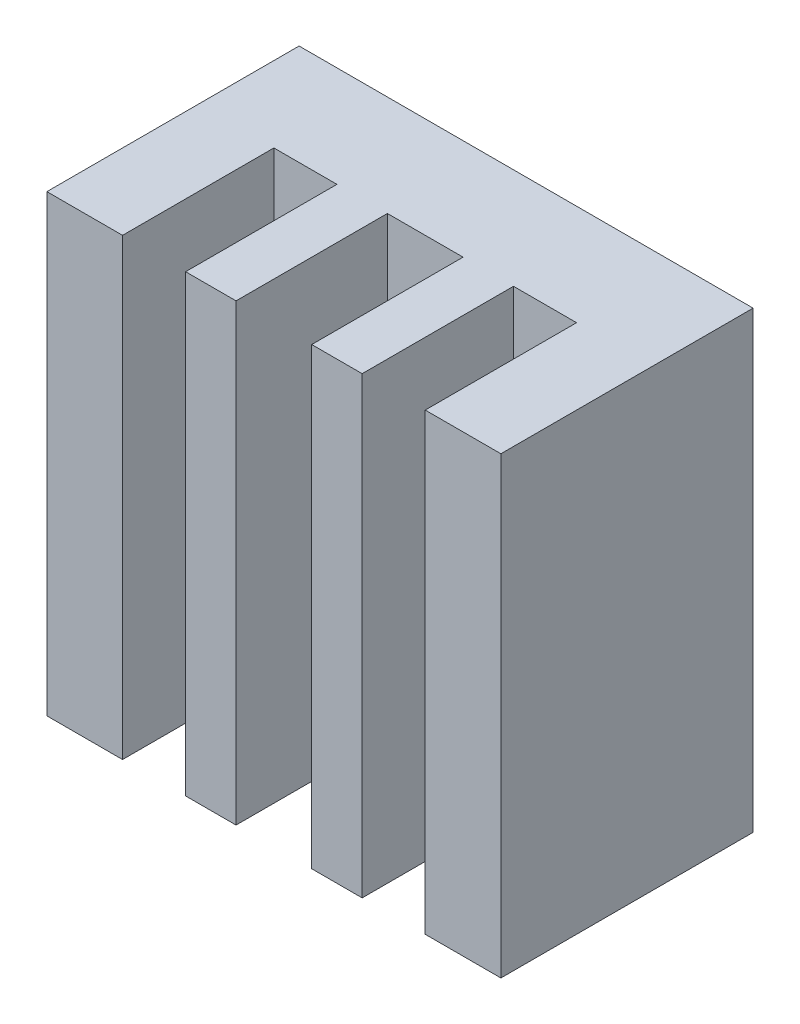
ISO-10303-21;
HEADER;
FILE_DESCRIPTION(('STEP AP214'),'2;1');
FILE_NAME('part.step','',(''),(''),'','','');
FILE_SCHEMA(('AUTOMOTIVE_DESIGN { 1 0 10303 214 1 1 1 1 }'));
ENDSEC;
DATA;
#1=APPLICATION_CONTEXT('core data for automotive mechanical design processes');
#2=APPLICATION_PROTOCOL_DEFINITION('international standard','automotive_design',2000,#1);
#3=PRODUCT_CONTEXT('',#1,'mechanical');
#4=PRODUCT('Part','Part','',(#3));
#5=PRODUCT_RELATED_PRODUCT_CATEGORY('part','',(#4));
#6=PRODUCT_DEFINITION_FORMATION('','',#4);
#7=PRODUCT_DEFINITION_CONTEXT('part definition',#1,'design');
#8=PRODUCT_DEFINITION('design','',#6,#7);
#9=PRODUCT_DEFINITION_SHAPE('','',#8);
#10=(LENGTH_UNIT() NAMED_UNIT(*) SI_UNIT(.MILLI.,.METRE.));
#11=(NAMED_UNIT(*) PLANE_ANGLE_UNIT() SI_UNIT($,.RADIAN.));
#12=(NAMED_UNIT(*) SI_UNIT($,.STERADIAN.) SOLID_ANGLE_UNIT());
#13=UNCERTAINTY_MEASURE_WITH_UNIT(LENGTH_MEASURE(1.E-05),#10,'distance_accuracy_value','');
#14=(GEOMETRIC_REPRESENTATION_CONTEXT(3) GLOBAL_UNCERTAINTY_ASSIGNED_CONTEXT((#13)) GLOBAL_UNIT_ASSIGNED_CONTEXT((#10,
#11,#12)) REPRESENTATION_CONTEXT('',''));
#15=CARTESIAN_POINT('',(0.,0.,0.));
#16=DIRECTION('',(0.,0.,1.));
#17=DIRECTION('',(1.,0.,0.));
#18=AXIS2_PLACEMENT_3D('',#15,#16,#17);
#19=CARTESIAN_POINT('',(0.,0.,5.));
#20=DIRECTION('',(0.,1.,0.));
#21=DIRECTION('',(0.,0.,1.));
#22=AXIS2_PLACEMENT_3D('',#19,#20,#21);
#23=PLANE('',#22);
#24=DIRECTION('',(0.,0.,-1.));
#25=VECTOR('',#24,1.);
#26=CARTESIAN_POINT('',(2.75,0.,0.));
#27=LINE('',#26,#25);
#28=CARTESIAN_POINT('',(2.75,0.,5.));
#29=VERTEX_POINT('',#28);
#30=CARTESIAN_POINT('',(2.75,0.,2.));
#31=VERTEX_POINT('',#30);
#32=EDGE_CURVE('E160',#29,#31,#27,.T.);
#33=ORIENTED_EDGE('',*,*,#32,.T.);
#34=DIRECTION('',(1.,0.,0.));
#35=VECTOR('',#34,1.);
#36=CARTESIAN_POINT('',(0.,0.,2.));
#37=LINE('',#36,#35);
#38=CARTESIAN_POINT('',(1.5,0.,2.));
#39=VERTEX_POINT('',#38);
#40=EDGE_CURVE('E316',#39,#31,#37,.T.);
#41=ORIENTED_EDGE('',*,*,#40,.F.);
#42=DIRECTION('',(0.,0.,-1.));
#43=VECTOR('',#42,1.);
#44=CARTESIAN_POINT('',(1.5,0.,0.));
#45=LINE('',#44,#43);
#46=CARTESIAN_POINT('',(1.5,0.,5.));
#47=VERTEX_POINT('',#46);
#48=EDGE_CURVE('E172',#47,#39,#45,.T.);
#49=ORIENTED_EDGE('',*,*,#48,.F.);
#50=DIRECTION('',(1.,0.,0.));
#51=VECTOR('',#50,1.);
#52=CARTESIAN_POINT('',(0.,0.,5.));
#53=LINE('',#52,#51);
#54=CARTESIAN_POINT('',(0.,0.,5.));
#55=VERTEX_POINT('',#54);
#56=EDGE_CURVE('E192',#55,#47,#53,.T.);
#57=ORIENTED_EDGE('',*,*,#56,.F.);
#58=DIRECTION('',(0.,0.,-1.));
#59=VECTOR('',#58,1.);
#60=CARTESIAN_POINT('',(0.,0.,5.));
#61=LINE('',#60,#59);
#62=CARTESIAN_POINT('',(0.,0.,0.));
#63=VERTEX_POINT('',#62);
#64=EDGE_CURVE('E239',#55,#63,#61,.T.);
#65=ORIENTED_EDGE('',*,*,#64,.T.);
#66=DIRECTION('',(1.,0.,0.));
#67=VECTOR('',#66,1.);
#68=CARTESIAN_POINT('',(0.,0.,0.));
#69=LINE('',#68,#67);
#70=CARTESIAN_POINT('',(9.,0.,0.));
#71=VERTEX_POINT('',#70);
#72=EDGE_CURVE('E218',#63,#71,#69,.T.);
#73=ORIENTED_EDGE('',*,*,#72,.T.);
#74=DIRECTION('',(0.,0.,-1.));
#75=VECTOR('',#74,1.);
#76=CARTESIAN_POINT('',(9.,0.,5.));
#77=LINE('',#76,#75);
#78=CARTESIAN_POINT('',(9.,0.,5.));
#79=VERTEX_POINT('',#78);
#80=EDGE_CURVE('E235',#79,#71,#77,.T.);
#81=ORIENTED_EDGE('',*,*,#80,.F.);
#82=CARTESIAN_POINT('',(7.5,0.,5.));
#83=VERTEX_POINT('',#82);
#84=EDGE_CURVE('E199',#83,#79,#53,.T.);
#85=ORIENTED_EDGE('',*,*,#84,.F.);
#86=DIRECTION('',(0.,0.,-1.));
#87=VECTOR('',#86,1.);
#88=CARTESIAN_POINT('',(7.5,0.,0.));
#89=LINE('',#88,#87);
#90=CARTESIAN_POINT('',(7.5,0.,2.));
#91=VERTEX_POINT('',#90);
#92=EDGE_CURVE('E284',#83,#91,#89,.T.);
#93=ORIENTED_EDGE('',*,*,#92,.T.);
#94=DIRECTION('',(1.,0.,0.));
#95=VECTOR('',#94,1.);
#96=CARTESIAN_POINT('',(0.,0.,2.));
#97=LINE('',#96,#95);
#98=CARTESIAN_POINT('',(6.25,0.,2.));
#99=VERTEX_POINT('',#98);
#100=EDGE_CURVE('E292',#99,#91,#97,.T.);
#101=ORIENTED_EDGE('',*,*,#100,.F.);
#102=DIRECTION('',(0.,0.,-1.));
#103=VECTOR('',#102,1.);
#104=CARTESIAN_POINT('',(6.25,0.,0.));
#105=LINE('',#104,#103);
#106=CARTESIAN_POINT('',(6.25,0.,5.));
#107=VERTEX_POINT('',#106);
#108=EDGE_CURVE('E288',#107,#99,#105,.T.);
#109=ORIENTED_EDGE('',*,*,#108,.F.);
#110=CARTESIAN_POINT('',(5.25,0.,5.));
#111=VERTEX_POINT('',#110);
#112=EDGE_CURVE('E193',#111,#107,#53,.T.);
#113=ORIENTED_EDGE('',*,*,#112,.F.);
#114=DIRECTION('',(0.,0.,-1.));
#115=VECTOR('',#114,1.);
#116=CARTESIAN_POINT('',(5.25,0.,0.));
#117=LINE('',#116,#115);
#118=CARTESIAN_POINT('',(5.25,0.,2.));
#119=VERTEX_POINT('',#118);
#120=EDGE_CURVE('E370',#111,#119,#117,.T.);
#121=ORIENTED_EDGE('',*,*,#120,.T.);
#122=DIRECTION('',(1.,0.,0.));
#123=VECTOR('',#122,1.);
#124=CARTESIAN_POINT('',(0.,0.,2.));
#125=LINE('',#124,#123);
#126=CARTESIAN_POINT('',(3.75,0.,2.));
#127=VERTEX_POINT('',#126);
#128=EDGE_CURVE('E300',#127,#119,#125,.T.);
#129=ORIENTED_EDGE('',*,*,#128,.F.);
#130=DIRECTION('',(0.,0.,-1.));
#131=VECTOR('',#130,1.);
#132=CARTESIAN_POINT('',(3.75,0.,0.));
#133=LINE('',#132,#131);
#134=CARTESIAN_POINT('',(3.75,0.,5.));
#135=VERTEX_POINT('',#134);
#136=EDGE_CURVE('E190',#135,#127,#133,.T.);
#137=ORIENTED_EDGE('',*,*,#136,.F.);
#138=EDGE_CURVE('E180',#29,#135,#53,.T.);
#139=ORIENTED_EDGE('',*,*,#138,.F.);
#140=EDGE_LOOP('',(#33,#41,#49,#57,#65,#73,#81,#85,#93,#101,#109,#113,#121,#129,#137,#139));
#141=FACE_BOUND('',#140,.T.);
#142=ADVANCED_FACE('F45',(#141),#23,.F.);
#143=CARTESIAN_POINT('',(0.,9.,5.));
#144=DIRECTION('',(0.,-1.,0.));
#145=DIRECTION('',(0.,0.,-1.));
#146=AXIS2_PLACEMENT_3D('',#143,#144,#145);
#147=PLANE('',#146);
#148=DIRECTION('',(0.,0.,-1.));
#149=VECTOR('',#148,1.);
#150=CARTESIAN_POINT('',(2.75,9.,5.));
#151=LINE('',#150,#149);
#152=CARTESIAN_POINT('',(2.75,9.,5.));
#153=VERTEX_POINT('',#152);
#154=CARTESIAN_POINT('',(2.75,9.,2.));
#155=VERTEX_POINT('',#154);
#156=EDGE_CURVE('E219',#153,#155,#151,.T.);
#157=ORIENTED_EDGE('',*,*,#156,.F.);
#158=DIRECTION('',(-1.,0.,0.));
#159=VECTOR('',#158,1.);
#160=CARTESIAN_POINT('',(0.,9.,5.));
#161=LINE('',#160,#159);
#162=CARTESIAN_POINT('',(3.75,9.,5.));
#163=VERTEX_POINT('',#162);
#164=EDGE_CURVE('E182',#163,#153,#161,.T.);
#165=ORIENTED_EDGE('',*,*,#164,.F.);
#166=DIRECTION('',(0.,0.,-1.));
#167=VECTOR('',#166,1.);
#168=CARTESIAN_POINT('',(3.75,9.,5.));
#169=LINE('',#168,#167);
#170=CARTESIAN_POINT('',(3.75,9.,2.));
#171=VERTEX_POINT('',#170);
#172=EDGE_CURVE('E268',#163,#171,#169,.T.);
#173=ORIENTED_EDGE('',*,*,#172,.T.);
#174=DIRECTION('',(1.,0.,0.));
#175=VECTOR('',#174,1.);
#176=CARTESIAN_POINT('',(0.,9.,2.));
#177=LINE('',#176,#175);
#178=CARTESIAN_POINT('',(5.25,9.,2.));
#179=VERTEX_POINT('',#178);
#180=EDGE_CURVE('E54',#171,#179,#177,.T.);
#181=ORIENTED_EDGE('',*,*,#180,.T.);
#182=DIRECTION('',(0.,0.,-1.));
#183=VECTOR('',#182,1.);
#184=CARTESIAN_POINT('',(5.25,9.,5.));
#185=LINE('',#184,#183);
#186=CARTESIAN_POINT('',(5.25,9.,5.));
#187=VERTEX_POINT('',#186);
#188=EDGE_CURVE('E266',#187,#179,#185,.T.);
#189=ORIENTED_EDGE('',*,*,#188,.F.);
#190=CARTESIAN_POINT('',(6.25,9.,5.));
#191=VERTEX_POINT('',#190);
#192=EDGE_CURVE('E213',#191,#187,#161,.T.);
#193=ORIENTED_EDGE('',*,*,#192,.F.);
#194=DIRECTION('',(0.,0.,-1.));
#195=VECTOR('',#194,1.);
#196=CARTESIAN_POINT('',(6.25,9.,5.));
#197=LINE('',#196,#195);
#198=CARTESIAN_POINT('',(6.25,9.,2.));
#199=VERTEX_POINT('',#198);
#200=EDGE_CURVE('E69',#191,#199,#197,.T.);
#201=ORIENTED_EDGE('',*,*,#200,.T.);
#202=DIRECTION('',(1.,0.,0.));
#203=VECTOR('',#202,1.);
#204=CARTESIAN_POINT('',(0.,9.,2.));
#205=LINE('',#204,#203);
#206=CARTESIAN_POINT('',(7.5,9.,2.));
#207=VERTEX_POINT('',#206);
#208=EDGE_CURVE('E184',#199,#207,#205,.T.);
#209=ORIENTED_EDGE('',*,*,#208,.T.);
#210=DIRECTION('',(0.,0.,-1.));
#211=VECTOR('',#210,1.);
#212=CARTESIAN_POINT('',(7.5,9.,5.));
#213=LINE('',#212,#211);
#214=CARTESIAN_POINT('',(7.5,9.,5.));
#215=VERTEX_POINT('',#214);
#216=EDGE_CURVE('E305',#215,#207,#213,.T.);
#217=ORIENTED_EDGE('',*,*,#216,.F.);
#218=CARTESIAN_POINT('',(9.,9.,5.));
#219=VERTEX_POINT('',#218);
#220=EDGE_CURVE('E208',#219,#215,#161,.T.);
#221=ORIENTED_EDGE('',*,*,#220,.F.);
#222=DIRECTION('',(0.,0.,-1.));
#223=VECTOR('',#222,1.);
#224=CARTESIAN_POINT('',(9.,9.,5.));
#225=LINE('',#224,#223);
#226=CARTESIAN_POINT('',(9.,9.,0.));
#227=VERTEX_POINT('',#226);
#228=EDGE_CURVE('E231',#219,#227,#225,.T.);
#229=ORIENTED_EDGE('',*,*,#228,.T.);
#230=DIRECTION('',(-1.,0.,0.));
#231=VECTOR('',#230,1.);
#232=CARTESIAN_POINT('',(0.,9.,0.));
#233=LINE('',#232,#231);
#234=CARTESIAN_POINT('',(0.,9.,0.));
#235=VERTEX_POINT('',#234);
#236=EDGE_CURVE('E225',#227,#235,#233,.T.);
#237=ORIENTED_EDGE('',*,*,#236,.T.);
#238=DIRECTION('',(0.,0.,-1.));
#239=VECTOR('',#238,1.);
#240=CARTESIAN_POINT('',(0.,9.,5.));
#241=LINE('',#240,#239);
#242=CARTESIAN_POINT('',(0.,9.,5.));
#243=VERTEX_POINT('',#242);
#244=EDGE_CURVE('E212',#243,#235,#241,.T.);
#245=ORIENTED_EDGE('',*,*,#244,.F.);
#246=CARTESIAN_POINT('',(1.5,9.,5.));
#247=VERTEX_POINT('',#246);
#248=EDGE_CURVE('E207',#247,#243,#161,.T.);
#249=ORIENTED_EDGE('',*,*,#248,.F.);
#250=DIRECTION('',(0.,0.,-1.));
#251=VECTOR('',#250,1.);
#252=CARTESIAN_POINT('',(1.5,9.,5.));
#253=LINE('',#252,#251);
#254=CARTESIAN_POINT('',(1.5,9.,2.));
#255=VERTEX_POINT('',#254);
#256=EDGE_CURVE('E61',#247,#255,#253,.T.);
#257=ORIENTED_EDGE('',*,*,#256,.T.);
#258=DIRECTION('',(1.,0.,0.));
#259=VECTOR('',#258,1.);
#260=CARTESIAN_POINT('',(0.,9.,2.));
#261=LINE('',#260,#259);
#262=EDGE_CURVE('E11',#255,#155,#261,.T.);
#263=ORIENTED_EDGE('',*,*,#262,.T.);
#264=EDGE_LOOP('',(#157,#165,#173,#181,#189,#193,#201,#209,#217,#221,#229,#237,#245,#249,#257,#263));
#265=FACE_BOUND('',#264,.T.);
#266=ADVANCED_FACE('F264',(#265),#147,.F.);
#267=CARTESIAN_POINT('',(0.,0.,5.));
#268=DIRECTION('',(0.,0.,-1.));
#269=DIRECTION('',(-1.,0.,0.));
#270=AXIS2_PLACEMENT_3D('',#267,#268,#269);
#271=PLANE('',#270);
#272=DIRECTION('',(0.,1.,0.));
#273=VECTOR('',#272,1.);
#274=CARTESIAN_POINT('',(2.75,0.,5.));
#275=LINE('',#274,#273);
#276=EDGE_CURVE('E163',#29,#153,#275,.T.);
#277=ORIENTED_EDGE('',*,*,#276,.F.);
#278=ORIENTED_EDGE('',*,*,#138,.T.);
#279=DIRECTION('',(0.,1.,0.));
#280=VECTOR('',#279,1.);
#281=CARTESIAN_POINT('',(3.75,0.,5.));
#282=LINE('',#281,#280);
#283=EDGE_CURVE('E252',#135,#163,#282,.T.);
#284=ORIENTED_EDGE('',*,*,#283,.T.);
#285=ORIENTED_EDGE('',*,*,#164,.T.);
#286=EDGE_LOOP('',(#277,#278,#284,#285));
#287=FACE_BOUND('',#286,.T.);
#288=ADVANCED_FACE('F178',(#287),#271,.F.);
#289=DIRECTION('',(0.,1.,0.));
#290=VECTOR('',#289,1.);
#291=CARTESIAN_POINT('',(5.25,0.,5.));
#292=LINE('',#291,#290);
#293=EDGE_CURVE('E249',#111,#187,#292,.T.);
#294=ORIENTED_EDGE('',*,*,#293,.F.);
#295=ORIENTED_EDGE('',*,*,#112,.T.);
#296=DIRECTION('',(0.,1.,0.));
#297=VECTOR('',#296,1.);
#298=CARTESIAN_POINT('',(6.25,0.,5.));
#299=LINE('',#298,#297);
#300=EDGE_CURVE('E243',#107,#191,#299,.T.);
#301=ORIENTED_EDGE('',*,*,#300,.T.);
#302=ORIENTED_EDGE('',*,*,#192,.T.);
#303=EDGE_LOOP('',(#294,#295,#301,#302));
#304=FACE_BOUND('',#303,.T.);
#305=ADVANCED_FACE('F330',(#304),#271,.F.);
#306=DIRECTION('',(0.,1.,0.));
#307=VECTOR('',#306,1.);
#308=CARTESIAN_POINT('',(7.5,0.,5.));
#309=LINE('',#308,#307);
#310=EDGE_CURVE('E246',#83,#215,#309,.T.);
#311=ORIENTED_EDGE('',*,*,#310,.F.);
#312=ORIENTED_EDGE('',*,*,#84,.T.);
#313=DIRECTION('',(0.,1.,0.));
#314=VECTOR('',#313,1.);
#315=CARTESIAN_POINT('',(9.,0.,5.));
#316=LINE('',#315,#314);
#317=EDGE_CURVE('E198',#79,#219,#316,.T.);
#318=ORIENTED_EDGE('',*,*,#317,.T.);
#319=ORIENTED_EDGE('',*,*,#220,.T.);
#320=EDGE_LOOP('',(#311,#312,#318,#319));
#321=FACE_BOUND('',#320,.T.);
#322=ADVANCED_FACE('F346',(#321),#271,.F.);
#323=CARTESIAN_POINT('',(0.,0.,5.));
#324=DIRECTION('',(1.,0.,0.));
#325=DIRECTION('',(0.,0.,-1.));
#326=AXIS2_PLACEMENT_3D('',#323,#324,#325);
#327=PLANE('',#326);
#328=DIRECTION('',(0.,-1.,0.));
#329=VECTOR('',#328,1.);
#330=CARTESIAN_POINT('',(0.,0.,0.));
#331=LINE('',#330,#329);
#332=EDGE_CURVE('E214',#235,#63,#331,.T.);
#333=ORIENTED_EDGE('',*,*,#332,.T.);
#334=ORIENTED_EDGE('',*,*,#64,.F.);
#335=DIRECTION('',(0.,-1.,0.));
#336=VECTOR('',#335,1.);
#337=CARTESIAN_POINT('',(0.,0.,5.));
#338=LINE('',#337,#336);
#339=EDGE_CURVE('E203',#243,#55,#338,.T.);
#340=ORIENTED_EDGE('',*,*,#339,.F.);
#341=ORIENTED_EDGE('',*,*,#244,.T.);
#342=EDGE_LOOP('',(#333,#334,#340,#341));
#343=FACE_BOUND('',#342,.T.);
#344=ADVANCED_FACE('F47',(#343),#327,.F.);
#345=CARTESIAN_POINT('',(9.,0.,5.));
#346=DIRECTION('',(-1.,0.,0.));
#347=DIRECTION('',(0.,0.,1.));
#348=AXIS2_PLACEMENT_3D('',#345,#346,#347);
#349=PLANE('',#348);
#350=DIRECTION('',(0.,1.,0.));
#351=VECTOR('',#350,1.);
#352=CARTESIAN_POINT('',(9.,0.,0.));
#353=LINE('',#352,#351);
#354=EDGE_CURVE('E222',#71,#227,#353,.T.);
#355=ORIENTED_EDGE('',*,*,#354,.T.);
#356=ORIENTED_EDGE('',*,*,#228,.F.);
#357=ORIENTED_EDGE('',*,*,#317,.F.);
#358=ORIENTED_EDGE('',*,*,#80,.T.);
#359=EDGE_LOOP('',(#355,#356,#357,#358));
#360=FACE_BOUND('',#359,.T.);
#361=ADVANCED_FACE('F392',(#360),#349,.F.);
#362=ORIENTED_EDGE('',*,*,#56,.T.);
#363=DIRECTION('',(0.,1.,0.));
#364=VECTOR('',#363,1.);
#365=CARTESIAN_POINT('',(1.5,0.,5.));
#366=LINE('',#365,#364);
#367=EDGE_CURVE('E185',#47,#247,#366,.T.);
#368=ORIENTED_EDGE('',*,*,#367,.T.);
#369=ORIENTED_EDGE('',*,*,#248,.T.);
#370=ORIENTED_EDGE('',*,*,#339,.T.);
#371=EDGE_LOOP('',(#362,#368,#369,#370));
#372=FACE_BOUND('',#371,.T.);
#373=ADVANCED_FACE('F359',(#372),#271,.F.);
#374=CARTESIAN_POINT('',(0.,0.,0.));
#375=DIRECTION('',(0.,0.,-1.));
#376=DIRECTION('',(-1.,0.,0.));
#377=AXIS2_PLACEMENT_3D('',#374,#375,#376);
#378=PLANE('',#377);
#379=ORIENTED_EDGE('',*,*,#332,.F.);
#380=ORIENTED_EDGE('',*,*,#236,.F.);
#381=ORIENTED_EDGE('',*,*,#354,.F.);
#382=ORIENTED_EDGE('',*,*,#72,.F.);
#383=EDGE_LOOP('',(#379,#380,#381,#382));
#384=FACE_BOUND('',#383,.T.);
#385=ADVANCED_FACE('F354',(#384),#378,.T.);
#386=CARTESIAN_POINT('',(0.,10.,2.));
#387=DIRECTION('',(0.,0.,-1.));
#388=DIRECTION('',(-1.,0.,0.));
#389=AXIS2_PLACEMENT_3D('',#386,#387,#388);
#390=PLANE('',#389);
#391=DIRECTION('',(0.,-1.,0.));
#392=VECTOR('',#391,1.);
#393=CARTESIAN_POINT('',(6.25,10.,2.));
#394=LINE('',#393,#392);
#395=EDGE_CURVE('E296',#199,#99,#394,.T.);
#396=ORIENTED_EDGE('',*,*,#395,.T.);
#397=ORIENTED_EDGE('',*,*,#100,.T.);
#398=DIRECTION('',(0.,-1.,0.));
#399=VECTOR('',#398,1.);
#400=CARTESIAN_POINT('',(7.5,10.,2.));
#401=LINE('',#400,#399);
#402=EDGE_CURVE('E297',#207,#91,#401,.T.);
#403=ORIENTED_EDGE('',*,*,#402,.F.);
#404=ORIENTED_EDGE('',*,*,#208,.F.);
#405=EDGE_LOOP('',(#396,#397,#403,#404));
#406=FACE_BOUND('',#405,.T.);
#407=ADVANCED_FACE('F336',(#406),#390,.F.);
#408=CARTESIAN_POINT('',(7.5,10.,0.));
#409=DIRECTION('',(-1.,0.,0.));
#410=DIRECTION('',(0.,0.,1.));
#411=AXIS2_PLACEMENT_3D('',#408,#409,#410);
#412=PLANE('',#411);
#413=ORIENTED_EDGE('',*,*,#216,.T.);
#414=ORIENTED_EDGE('',*,*,#402,.T.);
#415=ORIENTED_EDGE('',*,*,#92,.F.);
#416=ORIENTED_EDGE('',*,*,#310,.T.);
#417=EDGE_LOOP('',(#413,#414,#415,#416));
#418=FACE_BOUND('',#417,.T.);
#419=ADVANCED_FACE('F344',(#418),#412,.T.);
#420=CARTESIAN_POINT('',(6.25,10.,0.));
#421=DIRECTION('',(-1.,0.,0.));
#422=DIRECTION('',(0.,0.,1.));
#423=AXIS2_PLACEMENT_3D('',#420,#421,#422);
#424=PLANE('',#423);
#425=ORIENTED_EDGE('',*,*,#300,.F.);
#426=ORIENTED_EDGE('',*,*,#108,.T.);
#427=ORIENTED_EDGE('',*,*,#395,.F.);
#428=ORIENTED_EDGE('',*,*,#200,.F.);
#429=EDGE_LOOP('',(#425,#426,#427,#428));
#430=FACE_BOUND('',#429,.T.);
#431=ADVANCED_FACE('F337',(#430),#424,.F.);
#432=CARTESIAN_POINT('',(0.,10.,2.));
#433=DIRECTION('',(0.,0.,-1.));
#434=DIRECTION('',(-1.,0.,0.));
#435=AXIS2_PLACEMENT_3D('',#432,#433,#434);
#436=PLANE('',#435);
#437=DIRECTION('',(0.,-1.,0.));
#438=VECTOR('',#437,1.);
#439=CARTESIAN_POINT('',(3.75,10.,2.));
#440=LINE('',#439,#438);
#441=EDGE_CURVE('E173',#171,#127,#440,.T.);
#442=ORIENTED_EDGE('',*,*,#441,.T.);
#443=ORIENTED_EDGE('',*,*,#128,.T.);
#444=DIRECTION('',(0.,-1.,0.));
#445=VECTOR('',#444,1.);
#446=CARTESIAN_POINT('',(5.25,10.,2.));
#447=LINE('',#446,#445);
#448=EDGE_CURVE('E274',#179,#119,#447,.T.);
#449=ORIENTED_EDGE('',*,*,#448,.F.);
#450=ORIENTED_EDGE('',*,*,#180,.F.);
#451=EDGE_LOOP('',(#442,#443,#449,#450));
#452=FACE_BOUND('',#451,.T.);
#453=ADVANCED_FACE('F272',(#452),#436,.F.);
#454=CARTESIAN_POINT('',(3.75,10.,0.));
#455=DIRECTION('',(-1.,0.,0.));
#456=DIRECTION('',(0.,0.,1.));
#457=AXIS2_PLACEMENT_3D('',#454,#455,#456);
#458=PLANE('',#457);
#459=ORIENTED_EDGE('',*,*,#283,.F.);
#460=ORIENTED_EDGE('',*,*,#136,.T.);
#461=ORIENTED_EDGE('',*,*,#441,.F.);
#462=ORIENTED_EDGE('',*,*,#172,.F.);
#463=EDGE_LOOP('',(#459,#460,#461,#462));
#464=FACE_BOUND('',#463,.T.);
#465=ADVANCED_FACE('F276',(#464),#458,.F.);
#466=CARTESIAN_POINT('',(5.25,10.,0.));
#467=DIRECTION('',(-1.,0.,0.));
#468=DIRECTION('',(0.,0.,1.));
#469=AXIS2_PLACEMENT_3D('',#466,#467,#468);
#470=PLANE('',#469);
#471=ORIENTED_EDGE('',*,*,#188,.T.);
#472=ORIENTED_EDGE('',*,*,#448,.T.);
#473=ORIENTED_EDGE('',*,*,#120,.F.);
#474=ORIENTED_EDGE('',*,*,#293,.T.);
#475=EDGE_LOOP('',(#471,#472,#473,#474));
#476=FACE_BOUND('',#475,.T.);
#477=ADVANCED_FACE('F375',(#476),#470,.T.);
#478=CARTESIAN_POINT('',(0.,10.,2.));
#479=DIRECTION('',(0.,0.,-1.));
#480=DIRECTION('',(-1.,0.,0.));
#481=AXIS2_PLACEMENT_3D('',#478,#479,#480);
#482=PLANE('',#481);
#483=DIRECTION('',(0.,-1.,0.));
#484=VECTOR('',#483,1.);
#485=CARTESIAN_POINT('',(1.5,10.,2.));
#486=LINE('',#485,#484);
#487=EDGE_CURVE('E318',#255,#39,#486,.T.);
#488=ORIENTED_EDGE('',*,*,#487,.T.);
#489=ORIENTED_EDGE('',*,*,#40,.T.);
#490=DIRECTION('',(0.,-1.,0.));
#491=VECTOR('',#490,1.);
#492=CARTESIAN_POINT('',(2.75,10.,2.));
#493=LINE('',#492,#491);
#494=EDGE_CURVE('E166',#155,#31,#493,.T.);
#495=ORIENTED_EDGE('',*,*,#494,.F.);
#496=ORIENTED_EDGE('',*,*,#262,.F.);
#497=EDGE_LOOP('',(#488,#489,#495,#496));
#498=FACE_BOUND('',#497,.T.);
#499=ADVANCED_FACE('F315',(#498),#482,.F.);
#500=CARTESIAN_POINT('',(2.75,10.,0.));
#501=DIRECTION('',(-1.,0.,0.));
#502=DIRECTION('',(0.,0.,1.));
#503=AXIS2_PLACEMENT_3D('',#500,#501,#502);
#504=PLANE('',#503);
#505=ORIENTED_EDGE('',*,*,#156,.T.);
#506=ORIENTED_EDGE('',*,*,#494,.T.);
#507=ORIENTED_EDGE('',*,*,#32,.F.);
#508=ORIENTED_EDGE('',*,*,#276,.T.);
#509=EDGE_LOOP('',(#505,#506,#507,#508));
#510=FACE_BOUND('',#509,.T.);
#511=ADVANCED_FACE('F162',(#510),#504,.T.);
#512=CARTESIAN_POINT('',(1.5,10.,0.));
#513=DIRECTION('',(-1.,0.,0.));
#514=DIRECTION('',(0.,0.,1.));
#515=AXIS2_PLACEMENT_3D('',#512,#513,#514);
#516=PLANE('',#515);
#517=ORIENTED_EDGE('',*,*,#367,.F.);
#518=ORIENTED_EDGE('',*,*,#48,.T.);
#519=ORIENTED_EDGE('',*,*,#487,.F.);
#520=ORIENTED_EDGE('',*,*,#256,.F.);
#521=EDGE_LOOP('',(#517,#518,#519,#520));
#522=FACE_BOUND('',#521,.T.);
#523=ADVANCED_FACE('F437',(#522),#516,.F.);
#524=CLOSED_SHELL('',(#142,#266,#288,#305,#322,#344,#361,#373,#385,#407,#419,#431,#453,#465,
#477,#499,#511,#523));
#525=MANIFOLD_SOLID_BREP('B2',#524);
#526=ADVANCED_BREP_SHAPE_REPRESENTATION('',(#18,#525),#14);
#527=SHAPE_DEFINITION_REPRESENTATION(#9,#526);
ENDSEC;
END-ISO-10303-21;
